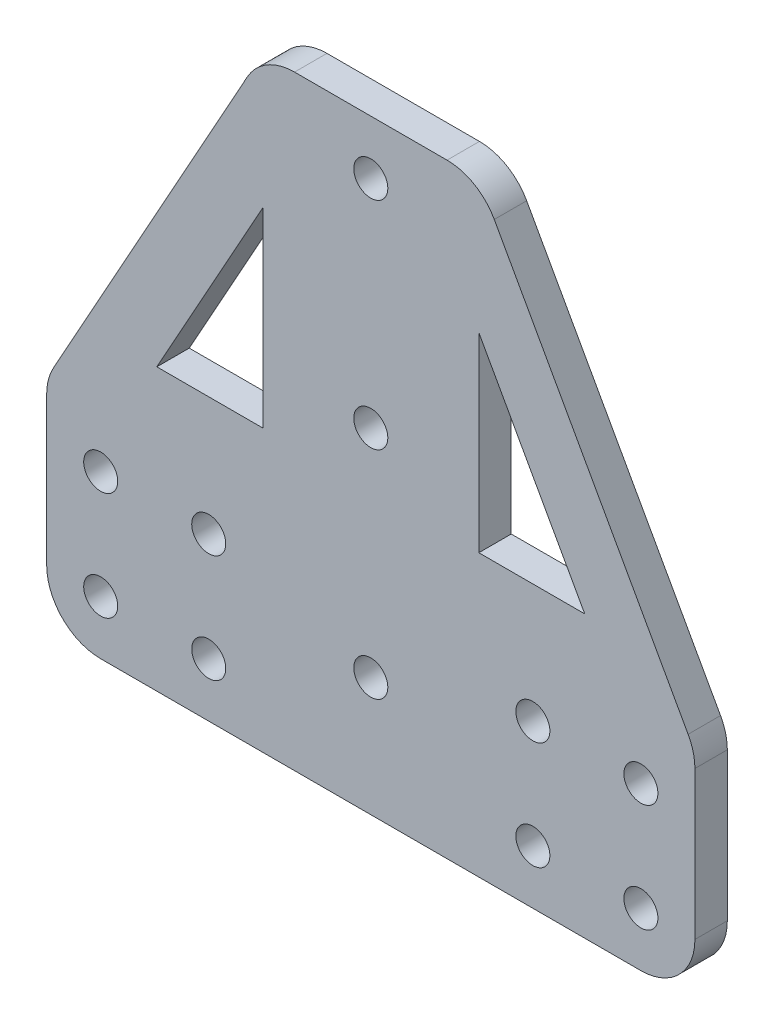
ISO-10303-21;
HEADER;
FILE_DESCRIPTION(('STEP AP214'),'2;1');
FILE_NAME('part.step','',(''),(''),'','','');
FILE_SCHEMA(('AUTOMOTIVE_DESIGN { 1 0 10303 214 1 1 1 1 }'));
ENDSEC;
DATA;
#1=APPLICATION_CONTEXT('core data for automotive mechanical design processes');
#2=APPLICATION_PROTOCOL_DEFINITION('international standard','automotive_design',2000,#1);
#3=PRODUCT_CONTEXT('',#1,'mechanical');
#4=PRODUCT('Part','Part','',(#3));
#5=PRODUCT_RELATED_PRODUCT_CATEGORY('part','',(#4));
#6=PRODUCT_DEFINITION_FORMATION('','',#4);
#7=PRODUCT_DEFINITION_CONTEXT('part definition',#1,'design');
#8=PRODUCT_DEFINITION('design','',#6,#7);
#9=PRODUCT_DEFINITION_SHAPE('','',#8);
#10=(LENGTH_UNIT() NAMED_UNIT(*) SI_UNIT(.MILLI.,.METRE.));
#11=(NAMED_UNIT(*) PLANE_ANGLE_UNIT() SI_UNIT($,.RADIAN.));
#12=(NAMED_UNIT(*) SI_UNIT($,.STERADIAN.) SOLID_ANGLE_UNIT());
#13=UNCERTAINTY_MEASURE_WITH_UNIT(LENGTH_MEASURE(1.E-05),#10,'distance_accuracy_value','');
#14=(GEOMETRIC_REPRESENTATION_CONTEXT(3) GLOBAL_UNCERTAINTY_ASSIGNED_CONTEXT((#13)) GLOBAL_UNIT_ASSIGNED_CONTEXT((#10,
#11,#12)) REPRESENTATION_CONTEXT('',''));
#15=CARTESIAN_POINT('',(0.,0.,0.));
#16=DIRECTION('',(0.,0.,1.));
#17=DIRECTION('',(1.,0.,0.));
#18=AXIS2_PLACEMENT_3D('',#15,#16,#17);
#19=CARTESIAN_POINT('',(-20.,-36.,3.));
#20=DIRECTION('',(0.874157276121538,-0.485642931178632,0.));
#21=DIRECTION('',(0.485642931178632,0.874157276121538,0.));
#22=AXIS2_PLACEMENT_3D('',#19,#20,#21);
#23=PLANE('',#22);
#24=DIRECTION('',(-0.485642931178632,-0.874157276121538,0.));
#25=VECTOR('',#24,1.);
#26=CARTESIAN_POINT('',(-20.,-36.,3.));
#27=LINE('',#26,#25);
#28=CARTESIAN_POINT('',(-1.42876963561491,-2.57178534410684,3.));
#29=VERTEX_POINT('',#28);
#30=CARTESIAN_POINT('',(-19.3707863806077,-34.8674154850938,3.));
#31=VERTEX_POINT('',#30);
#32=EDGE_CURVE('E313',#29,#31,#27,.T.);
#33=ORIENTED_EDGE('',*,*,#32,.F.);
#34=DIRECTION('',(0.,0.,-1.));
#35=VECTOR('',#34,1.);
#36=CARTESIAN_POINT('',(-1.42876963561491,-2.57178534410683,3.));
#37=LINE('',#36,#35);
#38=CARTESIAN_POINT('',(-1.42876963561491,-2.57178534410684,0.));
#39=VERTEX_POINT('',#38);
#40=EDGE_CURVE('E362',#29,#39,#37,.T.);
#41=ORIENTED_EDGE('',*,*,#40,.T.);
#42=DIRECTION('',(-0.485642931178632,-0.874157276121538,0.));
#43=VECTOR('',#42,1.);
#44=CARTESIAN_POINT('',(-20.,-36.,0.));
#45=LINE('',#44,#43);
#46=CARTESIAN_POINT('',(-19.3707863806077,-34.8674154850938,0.));
#47=VERTEX_POINT('',#46);
#48=EDGE_CURVE('E337',#39,#47,#45,.T.);
#49=ORIENTED_EDGE('',*,*,#48,.T.);
#50=DIRECTION('',(0.,0.,-1.));
#51=VECTOR('',#50,1.);
#52=CARTESIAN_POINT('',(-19.3707863806077,-34.8674154850938,3.));
#53=LINE('',#52,#51);
#54=EDGE_CURVE('E336',#47,#31,#53,.F.);
#55=ORIENTED_EDGE('',*,*,#54,.T.);
#56=EDGE_LOOP('',(#33,#41,#49,#55));
#57=FACE_BOUND('',#56,.T.);
#58=ADVANCED_FACE('F43',(#57),#23,.F.);
#59=CARTESIAN_POINT('',(-20.,-56.,3.));
#60=DIRECTION('',(1.,0.,0.));
#61=DIRECTION('',(0.,1.,0.));
#62=AXIS2_PLACEMENT_3D('',#59,#60,#61);
#63=PLANE('',#62);
#64=DIRECTION('',(0.,-1.,0.));
#65=VECTOR('',#64,1.);
#66=CARTESIAN_POINT('',(-20.,-56.,3.));
#67=LINE('',#66,#65);
#68=CARTESIAN_POINT('',(-20.,-37.295630140987,3.));
#69=VERTEX_POINT('',#68);
#70=CARTESIAN_POINT('',(-20.,-51.,3.));
#71=VERTEX_POINT('',#70);
#72=EDGE_CURVE('E317',#69,#71,#67,.T.);
#73=ORIENTED_EDGE('',*,*,#72,.F.);
#74=DIRECTION('',(0.,0.,-1.));
#75=VECTOR('',#74,1.);
#76=CARTESIAN_POINT('',(-20.,-37.295630140987,3.));
#77=LINE('',#76,#75);
#78=CARTESIAN_POINT('',(-20.,-37.295630140987,0.));
#79=VERTEX_POINT('',#78);
#80=EDGE_CURVE('E411',#69,#79,#77,.T.);
#81=ORIENTED_EDGE('',*,*,#80,.T.);
#82=DIRECTION('',(0.,-1.,0.));
#83=VECTOR('',#82,1.);
#84=CARTESIAN_POINT('',(-20.,-56.,0.));
#85=LINE('',#84,#83);
#86=CARTESIAN_POINT('',(-20.,-51.,0.));
#87=VERTEX_POINT('',#86);
#88=EDGE_CURVE('E341',#79,#87,#85,.T.);
#89=ORIENTED_EDGE('',*,*,#88,.T.);
#90=DIRECTION('',(0.,0.,-1.));
#91=VECTOR('',#90,1.);
#92=CARTESIAN_POINT('',(-20.,-51.,3.));
#93=LINE('',#92,#91);
#94=EDGE_CURVE('E408',#87,#71,#93,.F.);
#95=ORIENTED_EDGE('',*,*,#94,.T.);
#96=EDGE_LOOP('',(#73,#81,#89,#95));
#97=FACE_BOUND('',#96,.T.);
#98=ADVANCED_FACE('F495',(#97),#63,.F.);
#99=CARTESIAN_POINT('',(40.,-56.,3.));
#100=DIRECTION('',(0.,1.,0.));
#101=DIRECTION('',(0.,0.,1.));
#102=AXIS2_PLACEMENT_3D('',#99,#100,#101);
#103=PLANE('',#102);
#104=DIRECTION('',(1.,0.,0.));
#105=VECTOR('',#104,1.);
#106=CARTESIAN_POINT('',(40.,-56.,3.));
#107=LINE('',#106,#105);
#108=CARTESIAN_POINT('',(-15.,-56.,3.));
#109=VERTEX_POINT('',#108);
#110=CARTESIAN_POINT('',(35.,-56.,3.));
#111=VERTEX_POINT('',#110);
#112=EDGE_CURVE('E322',#109,#111,#107,.T.);
#113=ORIENTED_EDGE('',*,*,#112,.F.);
#114=DIRECTION('',(0.,0.,-1.));
#115=VECTOR('',#114,1.);
#116=CARTESIAN_POINT('',(-15.,-56.,3.));
#117=LINE('',#116,#115);
#118=CARTESIAN_POINT('',(-15.,-56.,0.));
#119=VERTEX_POINT('',#118);
#120=EDGE_CURVE('E418',#109,#119,#117,.T.);
#121=ORIENTED_EDGE('',*,*,#120,.T.);
#122=DIRECTION('',(1.,0.,0.));
#123=VECTOR('',#122,1.);
#124=CARTESIAN_POINT('',(40.,-56.,0.));
#125=LINE('',#124,#123);
#126=CARTESIAN_POINT('',(35.,-56.,0.));
#127=VERTEX_POINT('',#126);
#128=EDGE_CURVE('E346',#119,#127,#125,.T.);
#129=ORIENTED_EDGE('',*,*,#128,.T.);
#130=DIRECTION('',(0.,0.,-1.));
#131=VECTOR('',#130,1.);
#132=CARTESIAN_POINT('',(35.,-56.,3.));
#133=LINE('',#132,#131);
#134=EDGE_CURVE('E415',#127,#111,#133,.F.);
#135=ORIENTED_EDGE('',*,*,#134,.T.);
#136=EDGE_LOOP('',(#113,#121,#129,#135));
#137=FACE_BOUND('',#136,.T.);
#138=ADVANCED_FACE('F503',(#137),#103,.F.);
#139=CARTESIAN_POINT('',(40.,-36.,3.));
#140=DIRECTION('',(-1.,0.,0.));
#141=DIRECTION('',(0.,0.,1.));
#142=AXIS2_PLACEMENT_3D('',#139,#140,#141);
#143=PLANE('',#142);
#144=DIRECTION('',(0.,1.,0.));
#145=VECTOR('',#144,1.);
#146=CARTESIAN_POINT('',(40.,-36.,3.));
#147=LINE('',#146,#145);
#148=CARTESIAN_POINT('',(40.,-51.,3.));
#149=VERTEX_POINT('',#148);
#150=CARTESIAN_POINT('',(40.,-37.295630140987,3.));
#151=VERTEX_POINT('',#150);
#152=EDGE_CURVE('E326',#149,#151,#147,.T.);
#153=ORIENTED_EDGE('',*,*,#152,.F.);
#154=DIRECTION('',(0.,0.,-1.));
#155=VECTOR('',#154,1.);
#156=CARTESIAN_POINT('',(40.,-51.,3.));
#157=LINE('',#156,#155);
#158=CARTESIAN_POINT('',(40.,-51.,0.));
#159=VERTEX_POINT('',#158);
#160=EDGE_CURVE('E425',#149,#159,#157,.T.);
#161=ORIENTED_EDGE('',*,*,#160,.T.);
#162=DIRECTION('',(0.,1.,0.));
#163=VECTOR('',#162,1.);
#164=CARTESIAN_POINT('',(40.,-36.,0.));
#165=LINE('',#164,#163);
#166=CARTESIAN_POINT('',(40.,-37.295630140987,0.));
#167=VERTEX_POINT('',#166);
#168=EDGE_CURVE('E350',#159,#167,#165,.T.);
#169=ORIENTED_EDGE('',*,*,#168,.T.);
#170=DIRECTION('',(0.,0.,-1.));
#171=VECTOR('',#170,1.);
#172=CARTESIAN_POINT('',(40.,-37.295630140987,3.));
#173=LINE('',#172,#171);
#174=EDGE_CURVE('E422',#167,#151,#173,.F.);
#175=ORIENTED_EDGE('',*,*,#174,.T.);
#176=EDGE_LOOP('',(#153,#161,#169,#175));
#177=FACE_BOUND('',#176,.T.);
#178=ADVANCED_FACE('F511',(#177),#143,.F.);
#179=CARTESIAN_POINT('',(20.,0.,3.));
#180=DIRECTION('',(-0.874157276121538,-0.485642931178632,0.));
#181=DIRECTION('',(0.485642931178632,-0.874157276121538,0.));
#182=AXIS2_PLACEMENT_3D('',#179,#180,#181);
#183=PLANE('',#182);
#184=DIRECTION('',(-0.485642931178632,0.874157276121538,0.));
#185=VECTOR('',#184,1.);
#186=CARTESIAN_POINT('',(20.,0.,3.));
#187=LINE('',#186,#185);
#188=CARTESIAN_POINT('',(39.3707863806077,-34.8674154850938,3.));
#189=VERTEX_POINT('',#188);
#190=CARTESIAN_POINT('',(21.4287696356149,-2.57178534410684,3.));
#191=VERTEX_POINT('',#190);
#192=EDGE_CURVE('E329',#189,#191,#187,.T.);
#193=ORIENTED_EDGE('',*,*,#192,.F.);
#194=DIRECTION('',(0.,0.,-1.));
#195=VECTOR('',#194,1.);
#196=CARTESIAN_POINT('',(39.3707863806077,-34.8674154850938,3.));
#197=LINE('',#196,#195);
#198=CARTESIAN_POINT('',(39.3707863806077,-34.8674154850938,0.));
#199=VERTEX_POINT('',#198);
#200=EDGE_CURVE('E11',#189,#199,#197,.T.);
#201=ORIENTED_EDGE('',*,*,#200,.T.);
#202=DIRECTION('',(-0.485642931178632,0.874157276121538,0.));
#203=VECTOR('',#202,1.);
#204=CARTESIAN_POINT('',(20.,0.,0.));
#205=LINE('',#204,#203);
#206=CARTESIAN_POINT('',(21.4287696356149,-2.57178534410684,0.));
#207=VERTEX_POINT('',#206);
#208=EDGE_CURVE('E354',#199,#207,#205,.T.);
#209=ORIENTED_EDGE('',*,*,#208,.T.);
#210=DIRECTION('',(0.,0.,-1.));
#211=VECTOR('',#210,1.);
#212=CARTESIAN_POINT('',(21.4287696356149,-2.57178534410684,3.));
#213=LINE('',#212,#211);
#214=EDGE_CURVE('E52',#207,#191,#213,.F.);
#215=ORIENTED_EDGE('',*,*,#214,.T.);
#216=EDGE_LOOP('',(#193,#201,#209,#215));
#217=FACE_BOUND('',#216,.T.);
#218=ADVANCED_FACE('F518',(#217),#183,.F.);
#219=CARTESIAN_POINT('',(0.,0.,3.));
#220=DIRECTION('',(0.,-1.,0.));
#221=DIRECTION('',(1.,0.,0.));
#222=AXIS2_PLACEMENT_3D('',#219,#220,#221);
#223=PLANE('',#222);
#224=DIRECTION('',(-1.,0.,0.));
#225=VECTOR('',#224,1.);
#226=CARTESIAN_POINT('',(0.,0.,0.));
#227=LINE('',#226,#225);
#228=CARTESIAN_POINT('',(17.0579832550072,0.,0.));
#229=VERTEX_POINT('',#228);
#230=CARTESIAN_POINT('',(2.94201674499278,0.,0.));
#231=VERTEX_POINT('',#230);
#232=EDGE_CURVE('E318',#229,#231,#227,.T.);
#233=ORIENTED_EDGE('',*,*,#232,.T.);
#234=DIRECTION('',(0.,0.,-1.));
#235=VECTOR('',#234,1.);
#236=CARTESIAN_POINT('',(2.94201674499278,0.,3.));
#237=LINE('',#236,#235);
#238=CARTESIAN_POINT('',(2.94201674499278,0.,3.));
#239=VERTEX_POINT('',#238);
#240=EDGE_CURVE('E388',#231,#239,#237,.F.);
#241=ORIENTED_EDGE('',*,*,#240,.T.);
#242=DIRECTION('',(-1.,0.,0.));
#243=VECTOR('',#242,1.);
#244=CARTESIAN_POINT('',(0.,0.,3.));
#245=LINE('',#244,#243);
#246=CARTESIAN_POINT('',(17.0579832550072,0.,3.));
#247=VERTEX_POINT('',#246);
#248=EDGE_CURVE('E332',#247,#239,#245,.T.);
#249=ORIENTED_EDGE('',*,*,#248,.F.);
#250=DIRECTION('',(0.,0.,-1.));
#251=VECTOR('',#250,1.);
#252=CARTESIAN_POINT('',(17.0579832550072,0.,3.));
#253=LINE('',#252,#251);
#254=EDGE_CURVE('E384',#247,#229,#253,.T.);
#255=ORIENTED_EDGE('',*,*,#254,.T.);
#256=EDGE_LOOP('',(#233,#241,#249,#255));
#257=FACE_BOUND('',#256,.T.);
#258=ADVANCED_FACE('F524',(#257),#223,.F.);
#259=CARTESIAN_POINT('',(0.,0.,3.));
#260=DIRECTION('',(0.,0.,-1.));
#261=DIRECTION('',(-1.,0.,0.));
#262=AXIS2_PLACEMENT_3D('',#259,#260,#261);
#263=PLANE('',#262);
#264=CARTESIAN_POINT('',(10.,-5.,3.));
#265=DIRECTION('',(0.,0.,1.));
#266=DIRECTION('',(1.,0.,0.));
#267=AXIS2_PLACEMENT_3D('',#264,#265,#266);
#268=CIRCLE('',#267,1.575);
#269=CARTESIAN_POINT('',(11.575,-5.,3.));
#270=VERTEX_POINT('',#269);
#271=EDGE_CURVE('E301',#270,#270,#268,.T.);
#272=ORIENTED_EDGE('',*,*,#271,.F.);
#273=EDGE_LOOP('',(#272));
#274=FACE_BOUND('',#273,.T.);
#275=DIRECTION('',(0.,-1.,0.));
#276=VECTOR('',#275,1.);
#277=CARTESIAN_POINT('',(20.,-30.,3.));
#278=LINE('',#277,#276);
#279=CARTESIAN_POINT('',(20.,-12.3547561691844,3.));
#280=VERTEX_POINT('',#279);
#281=CARTESIAN_POINT('',(20.,-30.,3.));
#282=VERTEX_POINT('',#281);
#283=EDGE_CURVE('E230',#280,#282,#278,.T.);
#284=ORIENTED_EDGE('',*,*,#283,.F.);
#285=DIRECTION('',(-0.485642931178631,0.874157276121538,0.));
#286=VECTOR('',#285,1.);
#287=CARTESIAN_POINT('',(20.,-12.3547561691844,3.));
#288=LINE('',#287,#286);
#289=CARTESIAN_POINT('',(29.802913239342,-30.,3.));
#290=VERTEX_POINT('',#289);
#291=EDGE_CURVE('E181',#290,#280,#288,.T.);
#292=ORIENTED_EDGE('',*,*,#291,.F.);
#293=DIRECTION('',(1.,0.,0.));
#294=VECTOR('',#293,1.);
#295=CARTESIAN_POINT('',(29.802913239342,-30.,3.));
#296=LINE('',#295,#294);
#297=EDGE_CURVE('E226',#282,#290,#296,.T.);
#298=ORIENTED_EDGE('',*,*,#297,.F.);
#299=EDGE_LOOP('',(#284,#292,#298));
#300=FACE_BOUND('',#299,.T.);
#301=DIRECTION('',(-0.485642931178632,-0.874157276121538,0.));
#302=VECTOR('',#301,1.);
#303=CARTESIAN_POINT('',(0.,-12.3547561691844,3.));
#304=LINE('',#303,#302);
#305=CARTESIAN_POINT('',(0.,-12.3547561691844,3.));
#306=VERTEX_POINT('',#305);
#307=CARTESIAN_POINT('',(-9.80291323934199,-30.,3.));
#308=VERTEX_POINT('',#307);
#309=EDGE_CURVE('E191',#306,#308,#304,.T.);
#310=ORIENTED_EDGE('',*,*,#309,.F.);
#311=DIRECTION('',(0.,1.,0.));
#312=VECTOR('',#311,1.);
#313=CARTESIAN_POINT('',(0.,-30.,3.));
#314=LINE('',#313,#312);
#315=CARTESIAN_POINT('',(0.,-30.,3.));
#316=VERTEX_POINT('',#315);
#317=EDGE_CURVE('E173',#316,#306,#314,.T.);
#318=ORIENTED_EDGE('',*,*,#317,.F.);
#319=DIRECTION('',(1.,0.,0.));
#320=VECTOR('',#319,1.);
#321=CARTESIAN_POINT('',(-9.80291323934199,-30.,3.));
#322=LINE('',#321,#320);
#323=EDGE_CURVE('E184',#308,#316,#322,.T.);
#324=ORIENTED_EDGE('',*,*,#323,.F.);
#325=EDGE_LOOP('',(#310,#318,#324));
#326=FACE_BOUND('',#325,.T.);
#327=CARTESIAN_POINT('',(10.,-45.,3.));
#328=DIRECTION('',(0.,0.,1.));
#329=DIRECTION('',(1.,0.,0.));
#330=AXIS2_PLACEMENT_3D('',#327,#328,#329);
#331=CIRCLE('',#330,1.575);
#332=CARTESIAN_POINT('',(11.575,-45.,3.));
#333=VERTEX_POINT('',#332);
#334=EDGE_CURVE('E201',#333,#333,#331,.T.);
#335=ORIENTED_EDGE('',*,*,#334,.F.);
#336=EDGE_LOOP('',(#335));
#337=FACE_BOUND('',#336,.T.);
#338=CARTESIAN_POINT('',(35.,-41.,3.));
#339=DIRECTION('',(0.,0.,1.));
#340=DIRECTION('',(-1.,0.,0.));
#341=AXIS2_PLACEMENT_3D('',#338,#339,#340);
#342=CIRCLE('',#341,1.575);
#343=CARTESIAN_POINT('',(33.425,-41.,3.));
#344=VERTEX_POINT('',#343);
#345=EDGE_CURVE('E264',#344,#344,#342,.T.);
#346=ORIENTED_EDGE('',*,*,#345,.F.);
#347=EDGE_LOOP('',(#346));
#348=FACE_BOUND('',#347,.T.);
#349=CARTESIAN_POINT('',(-4.99999999999999,-51.,3.));
#350=DIRECTION('',(0.,0.,1.));
#351=DIRECTION('',(1.,0.,0.));
#352=AXIS2_PLACEMENT_3D('',#349,#350,#351);
#353=CIRCLE('',#352,1.575);
#354=CARTESIAN_POINT('',(-3.42499999999999,-51.,3.));
#355=VERTEX_POINT('',#354);
#356=EDGE_CURVE('E290',#355,#355,#353,.T.);
#357=ORIENTED_EDGE('',*,*,#356,.F.);
#358=EDGE_LOOP('',(#357));
#359=FACE_BOUND('',#358,.T.);
#360=CARTESIAN_POINT('',(-4.99999999999999,-41.,3.));
#361=DIRECTION('',(0.,0.,1.));
#362=DIRECTION('',(-1.,0.,0.));
#363=AXIS2_PLACEMENT_3D('',#360,#361,#362);
#364=CIRCLE('',#363,1.575);
#365=CARTESIAN_POINT('',(-6.57499999999999,-41.,3.));
#366=VERTEX_POINT('',#365);
#367=EDGE_CURVE('E281',#366,#366,#364,.T.);
#368=ORIENTED_EDGE('',*,*,#367,.F.);
#369=EDGE_LOOP('',(#368));
#370=FACE_BOUND('',#369,.T.);
#371=CARTESIAN_POINT('',(-15.,-41.,3.));
#372=DIRECTION('',(0.,0.,1.));
#373=DIRECTION('',(1.,0.,0.));
#374=AXIS2_PLACEMENT_3D('',#371,#372,#373);
#375=CIRCLE('',#374,1.575);
#376=CARTESIAN_POINT('',(-13.425,-41.,3.));
#377=VERTEX_POINT('',#376);
#378=EDGE_CURVE('E306',#377,#377,#375,.T.);
#379=ORIENTED_EDGE('',*,*,#378,.F.);
#380=EDGE_LOOP('',(#379));
#381=FACE_BOUND('',#380,.T.);
#382=CARTESIAN_POINT('',(10.,-25.,3.));
#383=DIRECTION('',(0.,0.,1.));
#384=DIRECTION('',(1.,0.,0.));
#385=AXIS2_PLACEMENT_3D('',#382,#383,#384);
#386=CIRCLE('',#385,1.575);
#387=CARTESIAN_POINT('',(11.575,-25.,3.));
#388=VERTEX_POINT('',#387);
#389=EDGE_CURVE('E297',#388,#388,#386,.T.);
#390=ORIENTED_EDGE('',*,*,#389,.F.);
#391=EDGE_LOOP('',(#390));
#392=FACE_BOUND('',#391,.T.);
#393=CARTESIAN_POINT('',(25.,-41.,3.));
#394=DIRECTION('',(0.,0.,1.));
#395=DIRECTION('',(1.,0.,0.));
#396=AXIS2_PLACEMENT_3D('',#393,#394,#395);
#397=CIRCLE('',#396,1.575);
#398=CARTESIAN_POINT('',(26.575,-41.,3.));
#399=VERTEX_POINT('',#398);
#400=EDGE_CURVE('E256',#399,#399,#397,.T.);
#401=ORIENTED_EDGE('',*,*,#400,.F.);
#402=EDGE_LOOP('',(#401));
#403=FACE_BOUND('',#402,.T.);
#404=CARTESIAN_POINT('',(25.,-51.,3.));
#405=DIRECTION('',(0.,0.,1.));
#406=DIRECTION('',(-1.,0.,0.));
#407=AXIS2_PLACEMENT_3D('',#404,#405,#406);
#408=CIRCLE('',#407,1.575);
#409=CARTESIAN_POINT('',(23.425,-51.,3.));
#410=VERTEX_POINT('',#409);
#411=EDGE_CURVE('E247',#410,#410,#408,.T.);
#412=ORIENTED_EDGE('',*,*,#411,.F.);
#413=EDGE_LOOP('',(#412));
#414=FACE_BOUND('',#413,.T.);
#415=CARTESIAN_POINT('',(35.,-51.,3.));
#416=DIRECTION('',(0.,0.,1.));
#417=DIRECTION('',(1.,0.,0.));
#418=AXIS2_PLACEMENT_3D('',#415,#416,#417);
#419=CIRCLE('',#418,1.575);
#420=CARTESIAN_POINT('',(36.575,-51.,3.));
#421=VERTEX_POINT('',#420);
#422=EDGE_CURVE('E274',#421,#421,#419,.T.);
#423=ORIENTED_EDGE('',*,*,#422,.F.);
#424=EDGE_LOOP('',(#423));
#425=FACE_BOUND('',#424,.T.);
#426=CARTESIAN_POINT('',(-15.,-51.,3.));
#427=DIRECTION('',(0.,0.,1.));
#428=DIRECTION('',(-1.,0.,0.));
#429=AXIS2_PLACEMENT_3D('',#426,#427,#428);
#430=CIRCLE('',#429,1.575);
#431=CARTESIAN_POINT('',(-16.575,-51.,3.));
#432=VERTEX_POINT('',#431);
#433=EDGE_CURVE('E265',#432,#432,#430,.T.);
#434=ORIENTED_EDGE('',*,*,#433,.F.);
#435=EDGE_LOOP('',(#434));
#436=FACE_BOUND('',#435,.T.);
#437=ORIENTED_EDGE('',*,*,#248,.T.);
#438=CARTESIAN_POINT('',(2.94201674499278,-4.99999999999999,3.));
#439=DIRECTION('',(0.,0.,-1.));
#440=DIRECTION('',(-1.,0.,0.));
#441=AXIS2_PLACEMENT_3D('',#438,#439,#440);
#442=CIRCLE('',#441,5.);
#443=EDGE_CURVE('E405',#239,#29,#442,.F.);
#444=ORIENTED_EDGE('',*,*,#443,.T.);
#445=ORIENTED_EDGE('',*,*,#32,.T.);
#446=CARTESIAN_POINT('',(-15.,-37.295630140987,3.));
#447=DIRECTION('',(0.,0.,-1.));
#448=DIRECTION('',(-1.,0.,0.));
#449=AXIS2_PLACEMENT_3D('',#446,#447,#448);
#450=CIRCLE('',#449,5.);
#451=EDGE_CURVE('E402',#31,#69,#450,.F.);
#452=ORIENTED_EDGE('',*,*,#451,.T.);
#453=ORIENTED_EDGE('',*,*,#72,.T.);
#454=CARTESIAN_POINT('',(-15.,-51.,3.));
#455=DIRECTION('',(0.,0.,-1.));
#456=DIRECTION('',(-1.,0.,0.));
#457=AXIS2_PLACEMENT_3D('',#454,#455,#456);
#458=CIRCLE('',#457,5.);
#459=EDGE_CURVE('E399',#71,#109,#458,.F.);
#460=ORIENTED_EDGE('',*,*,#459,.T.);
#461=ORIENTED_EDGE('',*,*,#112,.T.);
#462=CARTESIAN_POINT('',(35.,-51.,3.));
#463=DIRECTION('',(0.,0.,-1.));
#464=DIRECTION('',(-1.,0.,0.));
#465=AXIS2_PLACEMENT_3D('',#462,#463,#464);
#466=CIRCLE('',#465,5.);
#467=EDGE_CURVE('E396',#111,#149,#466,.F.);
#468=ORIENTED_EDGE('',*,*,#467,.T.);
#469=ORIENTED_EDGE('',*,*,#152,.T.);
#470=CARTESIAN_POINT('',(35.,-37.295630140987,3.));
#471=DIRECTION('',(0.,0.,-1.));
#472=DIRECTION('',(-1.,0.,0.));
#473=AXIS2_PLACEMENT_3D('',#470,#471,#472);
#474=CIRCLE('',#473,5.);
#475=EDGE_CURVE('E65',#151,#189,#474,.F.);
#476=ORIENTED_EDGE('',*,*,#475,.T.);
#477=ORIENTED_EDGE('',*,*,#192,.T.);
#478=CARTESIAN_POINT('',(17.0579832550072,-5.,3.));
#479=DIRECTION('',(0.,0.,-1.));
#480=DIRECTION('',(-1.,0.,0.));
#481=AXIS2_PLACEMENT_3D('',#478,#479,#480);
#482=CIRCLE('',#481,5.);
#483=EDGE_CURVE('E391',#191,#247,#482,.F.);
#484=ORIENTED_EDGE('',*,*,#483,.T.);
#485=EDGE_LOOP('',(#437,#444,#445,#452,#453,#460,#461,#468,#469,#476,#477,#484));
#486=FACE_BOUND('',#485,.T.);
#487=ADVANCED_FACE('F193',(#274,#300,#326,#337,#348,#359,#370,#381,#392,#403,#414,#425,#436,
#486),#263,.F.);
#488=CARTESIAN_POINT('',(0.,0.,0.));
#489=DIRECTION('',(0.,0.,-1.));
#490=DIRECTION('',(-1.,0.,0.));
#491=AXIS2_PLACEMENT_3D('',#488,#489,#490);
#492=PLANE('',#491);
#493=CARTESIAN_POINT('',(10.,-5.,0.));
#494=DIRECTION('',(0.,0.,1.));
#495=DIRECTION('',(1.,0.,0.));
#496=AXIS2_PLACEMENT_3D('',#493,#494,#495);
#497=CIRCLE('',#496,1.575);
#498=CARTESIAN_POINT('',(11.575,-5.,0.));
#499=VERTEX_POINT('',#498);
#500=EDGE_CURVE('E342',#499,#499,#497,.T.);
#501=ORIENTED_EDGE('',*,*,#500,.T.);
#502=EDGE_LOOP('',(#501));
#503=FACE_BOUND('',#502,.T.);
#504=DIRECTION('',(-0.485642931178631,0.874157276121538,0.));
#505=VECTOR('',#504,1.);
#506=CARTESIAN_POINT('',(20.,-12.3547561691844,0.));
#507=LINE('',#506,#505);
#508=CARTESIAN_POINT('',(29.802913239342,-30.,0.));
#509=VERTEX_POINT('',#508);
#510=CARTESIAN_POINT('',(20.,-12.3547561691844,0.));
#511=VERTEX_POINT('',#510);
#512=EDGE_CURVE('E231',#509,#511,#507,.T.);
#513=ORIENTED_EDGE('',*,*,#512,.T.);
#514=DIRECTION('',(0.,-1.,0.));
#515=VECTOR('',#514,1.);
#516=CARTESIAN_POINT('',(20.,-30.,0.));
#517=LINE('',#516,#515);
#518=CARTESIAN_POINT('',(20.,-30.,0.));
#519=VERTEX_POINT('',#518);
#520=EDGE_CURVE('E240',#511,#519,#517,.T.);
#521=ORIENTED_EDGE('',*,*,#520,.T.);
#522=DIRECTION('',(1.,0.,0.));
#523=VECTOR('',#522,1.);
#524=CARTESIAN_POINT('',(29.802913239342,-30.,0.));
#525=LINE('',#524,#523);
#526=EDGE_CURVE('E219',#519,#509,#525,.T.);
#527=ORIENTED_EDGE('',*,*,#526,.T.);
#528=EDGE_LOOP('',(#513,#521,#527));
#529=FACE_BOUND('',#528,.T.);
#530=DIRECTION('',(0.,1.,0.));
#531=VECTOR('',#530,1.);
#532=CARTESIAN_POINT('',(0.,-30.,0.));
#533=LINE('',#532,#531);
#534=CARTESIAN_POINT('',(0.,-30.,0.));
#535=VERTEX_POINT('',#534);
#536=CARTESIAN_POINT('',(0.,-12.3547561691844,0.));
#537=VERTEX_POINT('',#536);
#538=EDGE_CURVE('E176',#535,#537,#533,.T.);
#539=ORIENTED_EDGE('',*,*,#538,.T.);
#540=DIRECTION('',(-0.485642931178632,-0.874157276121538,0.));
#541=VECTOR('',#540,1.);
#542=CARTESIAN_POINT('',(0.,-12.3547561691844,0.));
#543=LINE('',#542,#541);
#544=CARTESIAN_POINT('',(-9.80291323934199,-30.,0.));
#545=VERTEX_POINT('',#544);
#546=EDGE_CURVE('E208',#537,#545,#543,.T.);
#547=ORIENTED_EDGE('',*,*,#546,.T.);
#548=DIRECTION('',(1.,0.,0.));
#549=VECTOR('',#548,1.);
#550=CARTESIAN_POINT('',(-9.80291323934199,-30.,0.));
#551=LINE('',#550,#549);
#552=EDGE_CURVE('E205',#545,#535,#551,.T.);
#553=ORIENTED_EDGE('',*,*,#552,.T.);
#554=EDGE_LOOP('',(#539,#547,#553));
#555=FACE_BOUND('',#554,.T.);
#556=CARTESIAN_POINT('',(10.,-45.,0.));
#557=DIRECTION('',(0.,0.,1.));
#558=DIRECTION('',(1.,0.,0.));
#559=AXIS2_PLACEMENT_3D('',#556,#557,#558);
#560=CIRCLE('',#559,1.575);
#561=CARTESIAN_POINT('',(11.575,-45.,0.));
#562=VERTEX_POINT('',#561);
#563=EDGE_CURVE('E196',#562,#562,#560,.T.);
#564=ORIENTED_EDGE('',*,*,#563,.T.);
#565=EDGE_LOOP('',(#564));
#566=FACE_BOUND('',#565,.T.);
#567=CARTESIAN_POINT('',(35.,-41.,0.));
#568=DIRECTION('',(0.,0.,1.));
#569=DIRECTION('',(-1.,0.,0.));
#570=AXIS2_PLACEMENT_3D('',#567,#568,#569);
#571=CIRCLE('',#570,1.575);
#572=CARTESIAN_POINT('',(33.425,-41.,0.));
#573=VERTEX_POINT('',#572);
#574=EDGE_CURVE('E438',#573,#573,#571,.T.);
#575=ORIENTED_EDGE('',*,*,#574,.T.);
#576=EDGE_LOOP('',(#575));
#577=FACE_BOUND('',#576,.T.);
#578=CARTESIAN_POINT('',(-4.99999999999999,-51.,0.));
#579=DIRECTION('',(0.,0.,1.));
#580=DIRECTION('',(1.,0.,0.));
#581=AXIS2_PLACEMENT_3D('',#578,#579,#580);
#582=CIRCLE('',#581,1.575);
#583=CARTESIAN_POINT('',(-3.42499999999999,-51.,0.));
#584=VERTEX_POINT('',#583);
#585=EDGE_CURVE('E269',#584,#584,#582,.T.);
#586=ORIENTED_EDGE('',*,*,#585,.T.);
#587=EDGE_LOOP('',(#586));
#588=FACE_BOUND('',#587,.T.);
#589=CARTESIAN_POINT('',(-4.99999999999999,-41.,0.));
#590=DIRECTION('',(0.,0.,1.));
#591=DIRECTION('',(-1.,0.,0.));
#592=AXIS2_PLACEMENT_3D('',#589,#590,#591);
#593=CIRCLE('',#592,1.575);
#594=CARTESIAN_POINT('',(-6.57499999999999,-41.,0.));
#595=VERTEX_POINT('',#594);
#596=EDGE_CURVE('E286',#595,#595,#593,.T.);
#597=ORIENTED_EDGE('',*,*,#596,.T.);
#598=EDGE_LOOP('',(#597));
#599=FACE_BOUND('',#598,.T.);
#600=CARTESIAN_POINT('',(-15.,-41.,0.));
#601=DIRECTION('',(0.,0.,1.));
#602=DIRECTION('',(1.,0.,0.));
#603=AXIS2_PLACEMENT_3D('',#600,#601,#602);
#604=CIRCLE('',#603,1.575);
#605=CARTESIAN_POINT('',(-13.425,-41.,0.));
#606=VERTEX_POINT('',#605);
#607=EDGE_CURVE('E285',#606,#606,#604,.T.);
#608=ORIENTED_EDGE('',*,*,#607,.T.);
#609=EDGE_LOOP('',(#608));
#610=FACE_BOUND('',#609,.T.);
#611=CARTESIAN_POINT('',(10.,-25.,0.));
#612=DIRECTION('',(0.,0.,1.));
#613=DIRECTION('',(1.,0.,0.));
#614=AXIS2_PLACEMENT_3D('',#611,#612,#613);
#615=CIRCLE('',#614,1.575);
#616=CARTESIAN_POINT('',(11.575,-25.,0.));
#617=VERTEX_POINT('',#616);
#618=EDGE_CURVE('E302',#617,#617,#615,.T.);
#619=ORIENTED_EDGE('',*,*,#618,.T.);
#620=EDGE_LOOP('',(#619));
#621=FACE_BOUND('',#620,.T.);
#622=CARTESIAN_POINT('',(25.,-41.,0.));
#623=DIRECTION('',(0.,0.,1.));
#624=DIRECTION('',(1.,0.,0.));
#625=AXIS2_PLACEMENT_3D('',#622,#623,#624);
#626=CIRCLE('',#625,1.575);
#627=CARTESIAN_POINT('',(26.575,-41.,0.));
#628=VERTEX_POINT('',#627);
#629=EDGE_CURVE('E260',#628,#628,#626,.T.);
#630=ORIENTED_EDGE('',*,*,#629,.T.);
#631=EDGE_LOOP('',(#630));
#632=FACE_BOUND('',#631,.T.);
#633=CARTESIAN_POINT('',(25.,-51.,0.));
#634=DIRECTION('',(0.,0.,1.));
#635=DIRECTION('',(-1.,0.,0.));
#636=AXIS2_PLACEMENT_3D('',#633,#634,#635);
#637=CIRCLE('',#636,1.575);
#638=CARTESIAN_POINT('',(23.425,-51.,0.));
#639=VERTEX_POINT('',#638);
#640=EDGE_CURVE('E252',#639,#639,#637,.T.);
#641=ORIENTED_EDGE('',*,*,#640,.T.);
#642=EDGE_LOOP('',(#641));
#643=FACE_BOUND('',#642,.T.);
#644=CARTESIAN_POINT('',(35.,-51.,0.));
#645=DIRECTION('',(0.,0.,1.));
#646=DIRECTION('',(1.,0.,0.));
#647=AXIS2_PLACEMENT_3D('',#644,#645,#646);
#648=CIRCLE('',#647,1.575);
#649=CARTESIAN_POINT('',(36.575,-51.,0.));
#650=VERTEX_POINT('',#649);
#651=EDGE_CURVE('E251',#650,#650,#648,.T.);
#652=ORIENTED_EDGE('',*,*,#651,.T.);
#653=EDGE_LOOP('',(#652));
#654=FACE_BOUND('',#653,.T.);
#655=CARTESIAN_POINT('',(-15.,-51.,0.));
#656=DIRECTION('',(0.,0.,1.));
#657=DIRECTION('',(-1.,0.,0.));
#658=AXIS2_PLACEMENT_3D('',#655,#656,#657);
#659=CIRCLE('',#658,1.575);
#660=CARTESIAN_POINT('',(-16.575,-51.,0.));
#661=VERTEX_POINT('',#660);
#662=EDGE_CURVE('E270',#661,#661,#659,.T.);
#663=ORIENTED_EDGE('',*,*,#662,.T.);
#664=EDGE_LOOP('',(#663));
#665=FACE_BOUND('',#664,.T.);
#666=ORIENTED_EDGE('',*,*,#48,.F.);
#667=CARTESIAN_POINT('',(2.94201674499278,-4.99999999999999,0.));
#668=DIRECTION('',(0.,0.,-1.));
#669=DIRECTION('',(-1.,0.,0.));
#670=AXIS2_PLACEMENT_3D('',#667,#668,#669);
#671=CIRCLE('',#670,5.);
#672=EDGE_CURVE('E381',#39,#231,#671,.T.);
#673=ORIENTED_EDGE('',*,*,#672,.T.);
#674=ORIENTED_EDGE('',*,*,#232,.F.);
#675=CARTESIAN_POINT('',(17.0579832550072,-5.,0.));
#676=DIRECTION('',(0.,0.,-1.));
#677=DIRECTION('',(-1.,0.,0.));
#678=AXIS2_PLACEMENT_3D('',#675,#676,#677);
#679=CIRCLE('',#678,5.);
#680=EDGE_CURVE('E366',#229,#207,#679,.T.);
#681=ORIENTED_EDGE('',*,*,#680,.T.);
#682=ORIENTED_EDGE('',*,*,#208,.F.);
#683=CARTESIAN_POINT('',(35.,-37.295630140987,0.));
#684=DIRECTION('',(0.,0.,-1.));
#685=DIRECTION('',(-1.,0.,0.));
#686=AXIS2_PLACEMENT_3D('',#683,#684,#685);
#687=CIRCLE('',#686,5.);
#688=EDGE_CURVE('E369',#199,#167,#687,.T.);
#689=ORIENTED_EDGE('',*,*,#688,.T.);
#690=ORIENTED_EDGE('',*,*,#168,.F.);
#691=CARTESIAN_POINT('',(35.,-51.,0.));
#692=DIRECTION('',(0.,0.,-1.));
#693=DIRECTION('',(-1.,0.,0.));
#694=AXIS2_PLACEMENT_3D('',#691,#692,#693);
#695=CIRCLE('',#694,5.);
#696=EDGE_CURVE('E372',#159,#127,#695,.T.);
#697=ORIENTED_EDGE('',*,*,#696,.T.);
#698=ORIENTED_EDGE('',*,*,#128,.F.);
#699=CARTESIAN_POINT('',(-15.,-51.,0.));
#700=DIRECTION('',(0.,0.,-1.));
#701=DIRECTION('',(-1.,0.,0.));
#702=AXIS2_PLACEMENT_3D('',#699,#700,#701);
#703=CIRCLE('',#702,5.);
#704=EDGE_CURVE('E375',#119,#87,#703,.T.);
#705=ORIENTED_EDGE('',*,*,#704,.T.);
#706=ORIENTED_EDGE('',*,*,#88,.F.);
#707=CARTESIAN_POINT('',(-15.,-37.295630140987,0.));
#708=DIRECTION('',(0.,0.,-1.));
#709=DIRECTION('',(-1.,0.,0.));
#710=AXIS2_PLACEMENT_3D('',#707,#708,#709);
#711=CIRCLE('',#710,5.);
#712=EDGE_CURVE('E378',#79,#47,#711,.T.);
#713=ORIENTED_EDGE('',*,*,#712,.T.);
#714=EDGE_LOOP('',(#666,#673,#674,#681,#682,#689,#690,#697,#698,#705,#706,#713));
#715=FACE_BOUND('',#714,.T.);
#716=ADVANCED_FACE('F455',(#503,#529,#555,#566,#577,#588,#599,#610,#621,#632,#643,#654,#665,
#715),#492,.T.);
#717=CARTESIAN_POINT('',(-15.,-51.,0.));
#718=DIRECTION('',(0.,0.,1.));
#719=DIRECTION('',(1.,0.,0.));
#720=AXIS2_PLACEMENT_3D('',#717,#718,#719);
#721=CYLINDRICAL_SURFACE('',#720,1.575);
#722=ORIENTED_EDGE('',*,*,#662,.F.);
#723=EDGE_LOOP('',(#722));
#724=FACE_BOUND('',#723,.T.);
#725=ORIENTED_EDGE('',*,*,#433,.T.);
#726=EDGE_LOOP('',(#725));
#727=FACE_BOUND('',#726,.T.);
#728=ADVANCED_FACE('F458',(#724,#727),#721,.F.);
#729=CARTESIAN_POINT('',(35.,-51.,0.));
#730=DIRECTION('',(0.,0.,1.));
#731=DIRECTION('',(1.,0.,0.));
#732=AXIS2_PLACEMENT_3D('',#729,#730,#731);
#733=CYLINDRICAL_SURFACE('',#732,1.575);
#734=ORIENTED_EDGE('',*,*,#651,.F.);
#735=EDGE_LOOP('',(#734));
#736=FACE_BOUND('',#735,.T.);
#737=ORIENTED_EDGE('',*,*,#422,.T.);
#738=EDGE_LOOP('',(#737));
#739=FACE_BOUND('',#738,.T.);
#740=ADVANCED_FACE('F576',(#736,#739),#733,.F.);
#741=CARTESIAN_POINT('',(25.,-51.,0.));
#742=DIRECTION('',(0.,0.,1.));
#743=DIRECTION('',(1.,0.,0.));
#744=AXIS2_PLACEMENT_3D('',#741,#742,#743);
#745=CYLINDRICAL_SURFACE('',#744,1.575);
#746=ORIENTED_EDGE('',*,*,#640,.F.);
#747=EDGE_LOOP('',(#746));
#748=FACE_BOUND('',#747,.T.);
#749=ORIENTED_EDGE('',*,*,#411,.T.);
#750=EDGE_LOOP('',(#749));
#751=FACE_BOUND('',#750,.T.);
#752=ADVANCED_FACE('F579',(#748,#751),#745,.F.);
#753=CARTESIAN_POINT('',(25.,-41.,0.));
#754=DIRECTION('',(0.,0.,1.));
#755=DIRECTION('',(1.,0.,0.));
#756=AXIS2_PLACEMENT_3D('',#753,#754,#755);
#757=CYLINDRICAL_SURFACE('',#756,1.575);
#758=ORIENTED_EDGE('',*,*,#629,.F.);
#759=EDGE_LOOP('',(#758));
#760=FACE_BOUND('',#759,.T.);
#761=ORIENTED_EDGE('',*,*,#400,.T.);
#762=EDGE_LOOP('',(#761));
#763=FACE_BOUND('',#762,.T.);
#764=ADVANCED_FACE('F566',(#760,#763),#757,.F.);
#765=CARTESIAN_POINT('',(10.,-25.,0.));
#766=DIRECTION('',(0.,0.,1.));
#767=DIRECTION('',(1.,0.,0.));
#768=AXIS2_PLACEMENT_3D('',#765,#766,#767);
#769=CYLINDRICAL_SURFACE('',#768,1.575);
#770=ORIENTED_EDGE('',*,*,#618,.F.);
#771=EDGE_LOOP('',(#770));
#772=FACE_BOUND('',#771,.T.);
#773=ORIENTED_EDGE('',*,*,#389,.T.);
#774=EDGE_LOOP('',(#773));
#775=FACE_BOUND('',#774,.T.);
#776=ADVANCED_FACE('F562',(#772,#775),#769,.F.);
#777=CARTESIAN_POINT('',(-15.,-41.,0.));
#778=DIRECTION('',(0.,0.,1.));
#779=DIRECTION('',(1.,0.,0.));
#780=AXIS2_PLACEMENT_3D('',#777,#778,#779);
#781=CYLINDRICAL_SURFACE('',#780,1.575);
#782=ORIENTED_EDGE('',*,*,#607,.F.);
#783=EDGE_LOOP('',(#782));
#784=FACE_BOUND('',#783,.T.);
#785=ORIENTED_EDGE('',*,*,#378,.T.);
#786=EDGE_LOOP('',(#785));
#787=FACE_BOUND('',#786,.T.);
#788=ADVANCED_FACE('F558',(#784,#787),#781,.F.);
#789=CARTESIAN_POINT('',(-4.99999999999999,-41.,0.));
#790=DIRECTION('',(0.,0.,1.));
#791=DIRECTION('',(1.,0.,0.));
#792=AXIS2_PLACEMENT_3D('',#789,#790,#791);
#793=CYLINDRICAL_SURFACE('',#792,1.575);
#794=ORIENTED_EDGE('',*,*,#596,.F.);
#795=EDGE_LOOP('',(#794));
#796=FACE_BOUND('',#795,.T.);
#797=ORIENTED_EDGE('',*,*,#367,.T.);
#798=EDGE_LOOP('',(#797));
#799=FACE_BOUND('',#798,.T.);
#800=ADVANCED_FACE('F561',(#796,#799),#793,.F.);
#801=CARTESIAN_POINT('',(-4.99999999999999,-51.,0.));
#802=DIRECTION('',(0.,0.,1.));
#803=DIRECTION('',(1.,0.,0.));
#804=AXIS2_PLACEMENT_3D('',#801,#802,#803);
#805=CYLINDRICAL_SURFACE('',#804,1.575);
#806=ORIENTED_EDGE('',*,*,#585,.F.);
#807=EDGE_LOOP('',(#806));
#808=FACE_BOUND('',#807,.T.);
#809=ORIENTED_EDGE('',*,*,#356,.T.);
#810=EDGE_LOOP('',(#809));
#811=FACE_BOUND('',#810,.T.);
#812=ADVANCED_FACE('F568',(#808,#811),#805,.F.);
#813=CARTESIAN_POINT('',(35.,-41.,0.));
#814=DIRECTION('',(0.,0.,1.));
#815=DIRECTION('',(1.,0.,0.));
#816=AXIS2_PLACEMENT_3D('',#813,#814,#815);
#817=CYLINDRICAL_SURFACE('',#816,1.575);
#818=ORIENTED_EDGE('',*,*,#574,.F.);
#819=EDGE_LOOP('',(#818));
#820=FACE_BOUND('',#819,.T.);
#821=ORIENTED_EDGE('',*,*,#345,.T.);
#822=EDGE_LOOP('',(#821));
#823=FACE_BOUND('',#822,.T.);
#824=ADVANCED_FACE('F571',(#820,#823),#817,.F.);
#825=CARTESIAN_POINT('',(10.,-45.,0.));
#826=DIRECTION('',(0.,0.,1.));
#827=DIRECTION('',(1.,0.,0.));
#828=AXIS2_PLACEMENT_3D('',#825,#826,#827);
#829=CYLINDRICAL_SURFACE('',#828,1.575);
#830=ORIENTED_EDGE('',*,*,#563,.F.);
#831=EDGE_LOOP('',(#830));
#832=FACE_BOUND('',#831,.T.);
#833=ORIENTED_EDGE('',*,*,#334,.T.);
#834=EDGE_LOOP('',(#833));
#835=FACE_BOUND('',#834,.T.);
#836=ADVANCED_FACE('F607',(#832,#835),#829,.F.);
#837=CARTESIAN_POINT('',(0.,-30.,0.));
#838=DIRECTION('',(1.,0.,0.));
#839=DIRECTION('',(0.,1.,0.));
#840=AXIS2_PLACEMENT_3D('',#837,#838,#839);
#841=PLANE('',#840);
#842=ORIENTED_EDGE('',*,*,#317,.T.);
#843=DIRECTION('',(0.,0.,1.));
#844=VECTOR('',#843,1.);
#845=CARTESIAN_POINT('',(0.,-12.3547561691844,0.));
#846=LINE('',#845,#844);
#847=EDGE_CURVE('E209',#537,#306,#846,.T.);
#848=ORIENTED_EDGE('',*,*,#847,.F.);
#849=ORIENTED_EDGE('',*,*,#538,.F.);
#850=DIRECTION('',(0.,0.,1.));
#851=VECTOR('',#850,1.);
#852=CARTESIAN_POINT('',(0.,-30.,0.));
#853=LINE('',#852,#851);
#854=EDGE_CURVE('E169',#535,#316,#853,.T.);
#855=ORIENTED_EDGE('',*,*,#854,.T.);
#856=EDGE_LOOP('',(#842,#848,#849,#855));
#857=FACE_BOUND('',#856,.T.);
#858=ADVANCED_FACE('F171',(#857),#841,.F.);
#859=CARTESIAN_POINT('',(-9.80291323934199,-30.,0.));
#860=DIRECTION('',(0.,-1.,0.));
#861=DIRECTION('',(0.,0.,-1.));
#862=AXIS2_PLACEMENT_3D('',#859,#860,#861);
#863=PLANE('',#862);
#864=ORIENTED_EDGE('',*,*,#323,.T.);
#865=ORIENTED_EDGE('',*,*,#854,.F.);
#866=ORIENTED_EDGE('',*,*,#552,.F.);
#867=DIRECTION('',(0.,0.,1.));
#868=VECTOR('',#867,1.);
#869=CARTESIAN_POINT('',(-9.80291323934199,-30.,0.));
#870=LINE('',#869,#868);
#871=EDGE_CURVE('E180',#545,#308,#870,.T.);
#872=ORIENTED_EDGE('',*,*,#871,.T.);
#873=EDGE_LOOP('',(#864,#865,#866,#872));
#874=FACE_BOUND('',#873,.T.);
#875=ADVANCED_FACE('F185',(#874),#863,.F.);
#876=CARTESIAN_POINT('',(0.,-12.3547561691844,0.));
#877=DIRECTION('',(-0.874157276121538,0.485642931178632,0.));
#878=DIRECTION('',(-0.485642931178632,-0.874157276121538,0.));
#879=AXIS2_PLACEMENT_3D('',#876,#877,#878);
#880=PLANE('',#879);
#881=ORIENTED_EDGE('',*,*,#309,.T.);
#882=ORIENTED_EDGE('',*,*,#871,.F.);
#883=ORIENTED_EDGE('',*,*,#546,.F.);
#884=ORIENTED_EDGE('',*,*,#847,.T.);
#885=EDGE_LOOP('',(#881,#882,#883,#884));
#886=FACE_BOUND('',#885,.T.);
#887=ADVANCED_FACE('F453',(#886),#880,.F.);
#888=CARTESIAN_POINT('',(20.,-12.3547561691844,0.));
#889=DIRECTION('',(0.874157276121538,0.485642931178631,0.));
#890=DIRECTION('',(-0.485642931178631,0.874157276121538,0.));
#891=AXIS2_PLACEMENT_3D('',#888,#889,#890);
#892=PLANE('',#891);
#893=ORIENTED_EDGE('',*,*,#291,.T.);
#894=DIRECTION('',(0.,0.,1.));
#895=VECTOR('',#894,1.);
#896=CARTESIAN_POINT('',(20.,-12.3547561691844,0.));
#897=LINE('',#896,#895);
#898=EDGE_CURVE('E215',#511,#280,#897,.T.);
#899=ORIENTED_EDGE('',*,*,#898,.F.);
#900=ORIENTED_EDGE('',*,*,#512,.F.);
#901=DIRECTION('',(0.,0.,1.));
#902=VECTOR('',#901,1.);
#903=CARTESIAN_POINT('',(29.802913239342,-30.,0.));
#904=LINE('',#903,#902);
#905=EDGE_CURVE('E223',#509,#290,#904,.T.);
#906=ORIENTED_EDGE('',*,*,#905,.T.);
#907=EDGE_LOOP('',(#893,#899,#900,#906));
#908=FACE_BOUND('',#907,.T.);
#909=ADVANCED_FACE('F593',(#908),#892,.F.);
#910=CARTESIAN_POINT('',(29.802913239342,-30.,0.));
#911=DIRECTION('',(0.,-1.,0.));
#912=DIRECTION('',(0.,0.,-1.));
#913=AXIS2_PLACEMENT_3D('',#910,#911,#912);
#914=PLANE('',#913);
#915=ORIENTED_EDGE('',*,*,#297,.T.);
#916=ORIENTED_EDGE('',*,*,#905,.F.);
#917=ORIENTED_EDGE('',*,*,#526,.F.);
#918=DIRECTION('',(0.,0.,1.));
#919=VECTOR('',#918,1.);
#920=CARTESIAN_POINT('',(20.,-30.,0.));
#921=LINE('',#920,#919);
#922=EDGE_CURVE('E220',#519,#282,#921,.T.);
#923=ORIENTED_EDGE('',*,*,#922,.T.);
#924=EDGE_LOOP('',(#915,#916,#917,#923));
#925=FACE_BOUND('',#924,.T.);
#926=ADVANCED_FACE('F590',(#925),#914,.F.);
#927=CARTESIAN_POINT('',(20.,-30.,0.));
#928=DIRECTION('',(-1.,0.,0.));
#929=DIRECTION('',(0.,-1.,0.));
#930=AXIS2_PLACEMENT_3D('',#927,#928,#929);
#931=PLANE('',#930);
#932=ORIENTED_EDGE('',*,*,#283,.T.);
#933=ORIENTED_EDGE('',*,*,#922,.F.);
#934=ORIENTED_EDGE('',*,*,#520,.F.);
#935=ORIENTED_EDGE('',*,*,#898,.T.);
#936=EDGE_LOOP('',(#932,#933,#934,#935));
#937=FACE_BOUND('',#936,.T.);
#938=ADVANCED_FACE('F537',(#937),#931,.F.);
#939=CARTESIAN_POINT('',(10.,-5.,0.));
#940=DIRECTION('',(0.,0.,1.));
#941=DIRECTION('',(1.,0.,0.));
#942=AXIS2_PLACEMENT_3D('',#939,#940,#941);
#943=CYLINDRICAL_SURFACE('',#942,1.575);
#944=ORIENTED_EDGE('',*,*,#500,.F.);
#945=EDGE_LOOP('',(#944));
#946=FACE_BOUND('',#945,.T.);
#947=ORIENTED_EDGE('',*,*,#271,.T.);
#948=EDGE_LOOP('',(#947));
#949=FACE_BOUND('',#948,.T.);
#950=ADVANCED_FACE('F530',(#946,#949),#943,.F.);
#951=CARTESIAN_POINT('',(2.94201674499278,-4.99999999999999,3.));
#952=DIRECTION('',(0.,0.,-1.));
#953=DIRECTION('',(-1.,0.,0.));
#954=AXIS2_PLACEMENT_3D('',#951,#952,#953);
#955=CYLINDRICAL_SURFACE('',#954,5.);
#956=ORIENTED_EDGE('',*,*,#443,.F.);
#957=ORIENTED_EDGE('',*,*,#240,.F.);
#958=ORIENTED_EDGE('',*,*,#672,.F.);
#959=ORIENTED_EDGE('',*,*,#40,.F.);
#960=EDGE_LOOP('',(#956,#957,#958,#959));
#961=FACE_BOUND('',#960,.T.);
#962=ADVANCED_FACE('F528',(#961),#955,.T.);
#963=CARTESIAN_POINT('',(-15.,-37.295630140987,3.));
#964=DIRECTION('',(0.,0.,-1.));
#965=DIRECTION('',(-1.,0.,0.));
#966=AXIS2_PLACEMENT_3D('',#963,#964,#965);
#967=CYLINDRICAL_SURFACE('',#966,5.);
#968=ORIENTED_EDGE('',*,*,#451,.F.);
#969=ORIENTED_EDGE('',*,*,#54,.F.);
#970=ORIENTED_EDGE('',*,*,#712,.F.);
#971=ORIENTED_EDGE('',*,*,#80,.F.);
#972=EDGE_LOOP('',(#968,#969,#970,#971));
#973=FACE_BOUND('',#972,.T.);
#974=ADVANCED_FACE('F490',(#973),#967,.T.);
#975=CARTESIAN_POINT('',(-15.,-51.,3.));
#976=DIRECTION('',(0.,0.,-1.));
#977=DIRECTION('',(-1.,0.,0.));
#978=AXIS2_PLACEMENT_3D('',#975,#976,#977);
#979=CYLINDRICAL_SURFACE('',#978,5.);
#980=ORIENTED_EDGE('',*,*,#459,.F.);
#981=ORIENTED_EDGE('',*,*,#94,.F.);
#982=ORIENTED_EDGE('',*,*,#704,.F.);
#983=ORIENTED_EDGE('',*,*,#120,.F.);
#984=EDGE_LOOP('',(#980,#981,#982,#983));
#985=FACE_BOUND('',#984,.T.);
#986=ADVANCED_FACE('F498',(#985),#979,.T.);
#987=CARTESIAN_POINT('',(35.,-51.,3.));
#988=DIRECTION('',(0.,0.,-1.));
#989=DIRECTION('',(-1.,0.,0.));
#990=AXIS2_PLACEMENT_3D('',#987,#988,#989);
#991=CYLINDRICAL_SURFACE('',#990,5.);
#992=ORIENTED_EDGE('',*,*,#467,.F.);
#993=ORIENTED_EDGE('',*,*,#134,.F.);
#994=ORIENTED_EDGE('',*,*,#696,.F.);
#995=ORIENTED_EDGE('',*,*,#160,.F.);
#996=EDGE_LOOP('',(#992,#993,#994,#995));
#997=FACE_BOUND('',#996,.T.);
#998=ADVANCED_FACE('F507',(#997),#991,.T.);
#999=CARTESIAN_POINT('',(35.,-37.295630140987,3.));
#1000=DIRECTION('',(0.,0.,-1.));
#1001=DIRECTION('',(-1.,0.,0.));
#1002=AXIS2_PLACEMENT_3D('',#999,#1000,#1001);
#1003=CYLINDRICAL_SURFACE('',#1002,5.);
#1004=ORIENTED_EDGE('',*,*,#475,.F.);
#1005=ORIENTED_EDGE('',*,*,#174,.F.);
#1006=ORIENTED_EDGE('',*,*,#688,.F.);
#1007=ORIENTED_EDGE('',*,*,#200,.F.);
#1008=EDGE_LOOP('',(#1004,#1005,#1006,#1007));
#1009=FACE_BOUND('',#1008,.T.);
#1010=ADVANCED_FACE('F515',(#1009),#1003,.T.);
#1011=CARTESIAN_POINT('',(17.0579832550072,-5.,3.));
#1012=DIRECTION('',(0.,0.,-1.));
#1013=DIRECTION('',(-1.,0.,0.));
#1014=AXIS2_PLACEMENT_3D('',#1011,#1012,#1013);
#1015=CYLINDRICAL_SURFACE('',#1014,5.);
#1016=ORIENTED_EDGE('',*,*,#483,.F.);
#1017=ORIENTED_EDGE('',*,*,#214,.F.);
#1018=ORIENTED_EDGE('',*,*,#680,.F.);
#1019=ORIENTED_EDGE('',*,*,#254,.F.);
#1020=EDGE_LOOP('',(#1016,#1017,#1018,#1019));
#1021=FACE_BOUND('',#1020,.T.);
#1022=ADVANCED_FACE('F45',(#1021),#1015,.T.);
#1023=CLOSED_SHELL('',(#58,#98,#138,#178,#218,#258,#487,#716,#728,#740,#752,#764,#776,#788,#800,
#812,#824,#836,#858,#875,#887,#909,#926,#938,#950,#962,#974,#986,#998,#1010,#1022));
#1024=MANIFOLD_SOLID_BREP('B2',#1023);
#1025=ADVANCED_BREP_SHAPE_REPRESENTATION('',(#18,#1024),#14);
#1026=SHAPE_DEFINITION_REPRESENTATION(#9,#1025);
ENDSEC;
END-ISO-10303-21;
